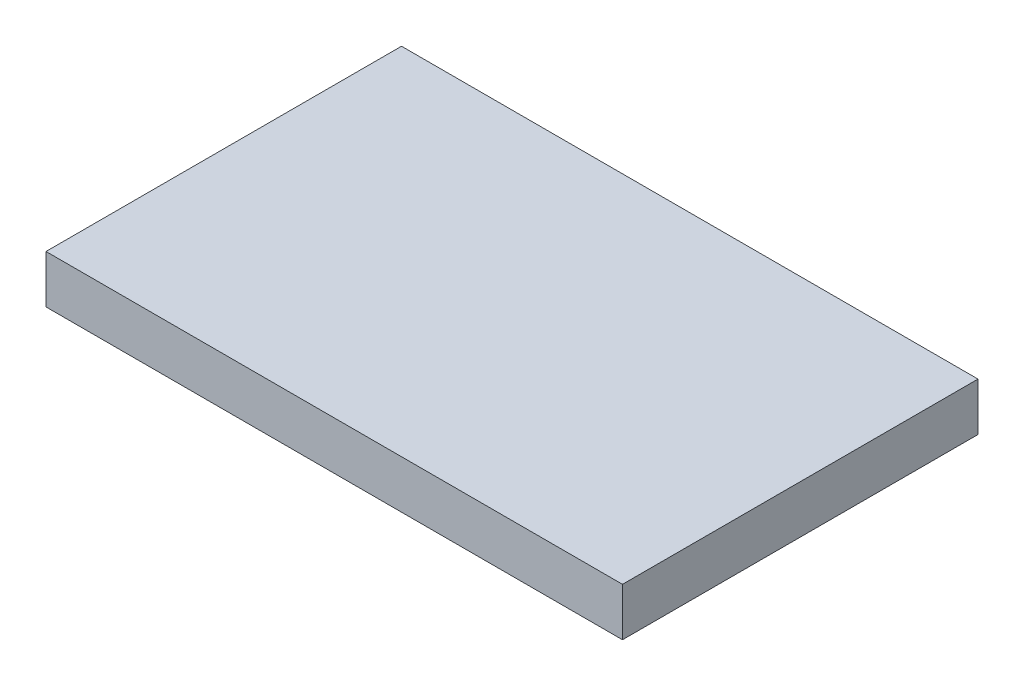
ISO-10303-21;
HEADER;
FILE_DESCRIPTION(('STEP AP214'),'2;1');
FILE_NAME('part.step','',(''),(''),'','','');
FILE_SCHEMA(('AUTOMOTIVE_DESIGN { 1 0 10303 214 1 1 1 1 }'));
ENDSEC;
DATA;
#1=APPLICATION_CONTEXT('core data for automotive mechanical design processes');
#2=APPLICATION_PROTOCOL_DEFINITION('international standard','automotive_design',2000,#1);
#3=PRODUCT_CONTEXT('',#1,'mechanical');
#4=PRODUCT('Part','Part','',(#3));
#5=PRODUCT_RELATED_PRODUCT_CATEGORY('part','',(#4));
#6=PRODUCT_DEFINITION_FORMATION('','',#4);
#7=PRODUCT_DEFINITION_CONTEXT('part definition',#1,'design');
#8=PRODUCT_DEFINITION('design','',#6,#7);
#9=PRODUCT_DEFINITION_SHAPE('','',#8);
#10=(LENGTH_UNIT() NAMED_UNIT(*) SI_UNIT(.MILLI.,.METRE.));
#11=(NAMED_UNIT(*) PLANE_ANGLE_UNIT() SI_UNIT($,.RADIAN.));
#12=(NAMED_UNIT(*) SI_UNIT($,.STERADIAN.) SOLID_ANGLE_UNIT());
#13=UNCERTAINTY_MEASURE_WITH_UNIT(LENGTH_MEASURE(1.E-05),#10,'distance_accuracy_value','');
#14=(GEOMETRIC_REPRESENTATION_CONTEXT(3) GLOBAL_UNCERTAINTY_ASSIGNED_CONTEXT((#13)) GLOBAL_UNIT_ASSIGNED_CONTEXT((#10,
#11,#12)) REPRESENTATION_CONTEXT('',''));
#15=CARTESIAN_POINT('',(0.,0.,0.));
#16=DIRECTION('',(0.,0.,1.));
#17=DIRECTION('',(1.,0.,0.));
#18=AXIS2_PLACEMENT_3D('',#15,#16,#17);
#19=CARTESIAN_POINT('',(30.,5.,-18.5));
#20=DIRECTION('',(-1.,0.,0.));
#21=DIRECTION('',(0.,0.,1.));
#22=AXIS2_PLACEMENT_3D('',#19,#20,#21);
#23=PLANE('',#22);
#24=DIRECTION('',(0.,0.,-1.));
#25=VECTOR('',#24,1.);
#26=CARTESIAN_POINT('',(30.,0.,-18.5));
#27=LINE('',#26,#25);
#28=CARTESIAN_POINT('',(30.,0.,18.5));
#29=VERTEX_POINT('',#28);
#30=CARTESIAN_POINT('',(30.,0.,-18.5));
#31=VERTEX_POINT('',#30);
#32=EDGE_CURVE('E106',#29,#31,#27,.T.);
#33=ORIENTED_EDGE('',*,*,#32,.T.);
#34=DIRECTION('',(0.,-1.,0.));
#35=VECTOR('',#34,1.);
#36=CARTESIAN_POINT('',(30.,5.,-18.5));
#37=LINE('',#36,#35);
#38=CARTESIAN_POINT('',(30.,5.,-18.5));
#39=VERTEX_POINT('',#38);
#40=EDGE_CURVE('E11',#39,#31,#37,.T.);
#41=ORIENTED_EDGE('',*,*,#40,.F.);
#42=DIRECTION('',(0.,0.,-1.));
#43=VECTOR('',#42,1.);
#44=CARTESIAN_POINT('',(30.,5.,-18.5));
#45=LINE('',#44,#43);
#46=CARTESIAN_POINT('',(30.,5.,18.5));
#47=VERTEX_POINT('',#46);
#48=EDGE_CURVE('E90',#47,#39,#45,.T.);
#49=ORIENTED_EDGE('',*,*,#48,.F.);
#50=DIRECTION('',(0.,-1.,0.));
#51=VECTOR('',#50,1.);
#52=CARTESIAN_POINT('',(30.,5.,18.5));
#53=LINE('',#52,#51);
#54=EDGE_CURVE('E102',#47,#29,#53,.T.);
#55=ORIENTED_EDGE('',*,*,#54,.T.);
#56=EDGE_LOOP('',(#33,#41,#49,#55));
#57=FACE_BOUND('',#56,.T.);
#58=ADVANCED_FACE('F38',(#57),#23,.F.);
#59=CARTESIAN_POINT('',(-30.,5.,-18.5));
#60=DIRECTION('',(0.,0.,1.));
#61=DIRECTION('',(1.,0.,0.));
#62=AXIS2_PLACEMENT_3D('',#59,#60,#61);
#63=PLANE('',#62);
#64=DIRECTION('',(-1.,0.,0.));
#65=VECTOR('',#64,1.);
#66=CARTESIAN_POINT('',(-30.,0.,-18.5));
#67=LINE('',#66,#65);
#68=CARTESIAN_POINT('',(-30.,0.,-18.5));
#69=VERTEX_POINT('',#68);
#70=EDGE_CURVE('E95',#31,#69,#67,.T.);
#71=ORIENTED_EDGE('',*,*,#70,.T.);
#72=DIRECTION('',(0.,-1.,0.));
#73=VECTOR('',#72,1.);
#74=CARTESIAN_POINT('',(-30.,5.,-18.5));
#75=LINE('',#74,#73);
#76=CARTESIAN_POINT('',(-30.,5.,-18.5));
#77=VERTEX_POINT('',#76);
#78=EDGE_CURVE('E47',#77,#69,#75,.T.);
#79=ORIENTED_EDGE('',*,*,#78,.F.);
#80=DIRECTION('',(-1.,0.,0.));
#81=VECTOR('',#80,1.);
#82=CARTESIAN_POINT('',(-30.,5.,-18.5));
#83=LINE('',#82,#81);
#84=EDGE_CURVE('E85',#39,#77,#83,.T.);
#85=ORIENTED_EDGE('',*,*,#84,.F.);
#86=ORIENTED_EDGE('',*,*,#40,.T.);
#87=EDGE_LOOP('',(#71,#79,#85,#86));
#88=FACE_BOUND('',#87,.T.);
#89=ADVANCED_FACE('F94',(#88),#63,.F.);
#90=CARTESIAN_POINT('',(-30.,5.,-18.5));
#91=DIRECTION('',(1.,0.,0.));
#92=DIRECTION('',(0.,0.,-1.));
#93=AXIS2_PLACEMENT_3D('',#90,#91,#92);
#94=PLANE('',#93);
#95=DIRECTION('',(0.,0.,1.));
#96=VECTOR('',#95,1.);
#97=CARTESIAN_POINT('',(-30.,0.,-18.5));
#98=LINE('',#97,#96);
#99=CARTESIAN_POINT('',(-30.,0.,18.5));
#100=VERTEX_POINT('',#99);
#101=EDGE_CURVE('E72',#69,#100,#98,.T.);
#102=ORIENTED_EDGE('',*,*,#101,.T.);
#103=DIRECTION('',(0.,-1.,0.));
#104=VECTOR('',#103,1.);
#105=CARTESIAN_POINT('',(-30.,5.,18.5));
#106=LINE('',#105,#104);
#107=CARTESIAN_POINT('',(-30.,5.,18.5));
#108=VERTEX_POINT('',#107);
#109=EDGE_CURVE('E97',#108,#100,#106,.T.);
#110=ORIENTED_EDGE('',*,*,#109,.F.);
#111=DIRECTION('',(0.,0.,1.));
#112=VECTOR('',#111,1.);
#113=CARTESIAN_POINT('',(-30.,5.,-18.5));
#114=LINE('',#113,#112);
#115=EDGE_CURVE('E88',#77,#108,#114,.T.);
#116=ORIENTED_EDGE('',*,*,#115,.F.);
#117=ORIENTED_EDGE('',*,*,#78,.T.);
#118=EDGE_LOOP('',(#102,#110,#116,#117));
#119=FACE_BOUND('',#118,.T.);
#120=ADVANCED_FACE('F98',(#119),#94,.F.);
#121=CARTESIAN_POINT('',(-30.,5.,18.5));
#122=DIRECTION('',(0.,0.,-1.));
#123=DIRECTION('',(-1.,0.,0.));
#124=AXIS2_PLACEMENT_3D('',#121,#122,#123);
#125=PLANE('',#124);
#126=DIRECTION('',(1.,0.,0.));
#127=VECTOR('',#126,1.);
#128=CARTESIAN_POINT('',(-30.,0.,18.5));
#129=LINE('',#128,#127);
#130=EDGE_CURVE('E78',#100,#29,#129,.T.);
#131=ORIENTED_EDGE('',*,*,#130,.T.);
#132=ORIENTED_EDGE('',*,*,#54,.F.);
#133=DIRECTION('',(1.,0.,0.));
#134=VECTOR('',#133,1.);
#135=CARTESIAN_POINT('',(-30.,5.,18.5));
#136=LINE('',#135,#134);
#137=EDGE_CURVE('E55',#108,#47,#136,.T.);
#138=ORIENTED_EDGE('',*,*,#137,.F.);
#139=ORIENTED_EDGE('',*,*,#109,.T.);
#140=EDGE_LOOP('',(#131,#132,#138,#139));
#141=FACE_BOUND('',#140,.T.);
#142=ADVANCED_FACE('F119',(#141),#125,.F.);
#143=CARTESIAN_POINT('',(0.,5.,0.));
#144=DIRECTION('',(0.,1.,0.));
#145=DIRECTION('',(0.,0.,1.));
#146=AXIS2_PLACEMENT_3D('',#143,#144,#145);
#147=PLANE('',#146);
#148=ORIENTED_EDGE('',*,*,#48,.T.);
#149=ORIENTED_EDGE('',*,*,#84,.T.);
#150=ORIENTED_EDGE('',*,*,#115,.T.);
#151=ORIENTED_EDGE('',*,*,#137,.T.);
#152=EDGE_LOOP('',(#148,#149,#150,#151));
#153=FACE_BOUND('',#152,.T.);
#154=ADVANCED_FACE('F86',(#153),#147,.T.);
#155=CARTESIAN_POINT('',(0.,0.,0.));
#156=DIRECTION('',(0.,1.,0.));
#157=DIRECTION('',(0.,0.,1.));
#158=AXIS2_PLACEMENT_3D('',#155,#156,#157);
#159=PLANE('',#158);
#160=ORIENTED_EDGE('',*,*,#32,.F.);
#161=ORIENTED_EDGE('',*,*,#130,.F.);
#162=ORIENTED_EDGE('',*,*,#101,.F.);
#163=ORIENTED_EDGE('',*,*,#70,.F.);
#164=EDGE_LOOP('',(#160,#161,#162,#163));
#165=FACE_BOUND('',#164,.T.);
#166=ADVANCED_FACE('F122',(#165),#159,.F.);
#167=CLOSED_SHELL('',(#58,#89,#120,#142,#154,#166));
#168=MANIFOLD_SOLID_BREP('B2',#167);
#169=ADVANCED_BREP_SHAPE_REPRESENTATION('',(#18,#168),#14);
#170=SHAPE_DEFINITION_REPRESENTATION(#9,#169);
ENDSEC;
END-ISO-10303-21;
